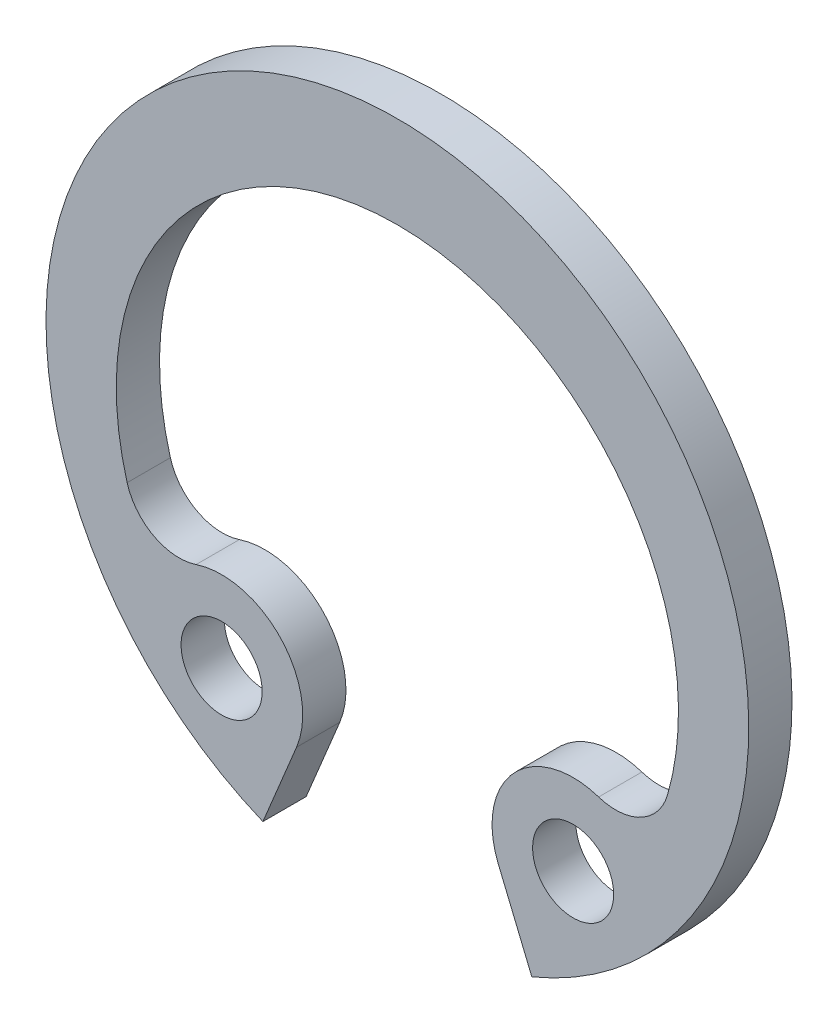
ISO-10303-21;
HEADER;
FILE_DESCRIPTION(('STEP AP214'),'2;1');
FILE_NAME('part.step','',(''),(''),'','','');
FILE_SCHEMA(('AUTOMOTIVE_DESIGN { 1 0 10303 214 1 1 1 1 }'));
ENDSEC;
DATA;
#1=APPLICATION_CONTEXT('core data for automotive mechanical design processes');
#2=APPLICATION_PROTOCOL_DEFINITION('international standard','automotive_design',2000,#1);
#3=PRODUCT_CONTEXT('',#1,'mechanical');
#4=PRODUCT('Part','Part','',(#3));
#5=PRODUCT_RELATED_PRODUCT_CATEGORY('part','',(#4));
#6=PRODUCT_DEFINITION_FORMATION('','',#4);
#7=PRODUCT_DEFINITION_CONTEXT('part definition',#1,'design');
#8=PRODUCT_DEFINITION('design','',#6,#7);
#9=PRODUCT_DEFINITION_SHAPE('','',#8);
#10=(LENGTH_UNIT() NAMED_UNIT(*) SI_UNIT(.MILLI.,.METRE.));
#11=(NAMED_UNIT(*) PLANE_ANGLE_UNIT() SI_UNIT($,.RADIAN.));
#12=(NAMED_UNIT(*) SI_UNIT($,.STERADIAN.) SOLID_ANGLE_UNIT());
#13=UNCERTAINTY_MEASURE_WITH_UNIT(LENGTH_MEASURE(1.E-05),#10,'distance_accuracy_value','');
#14=(GEOMETRIC_REPRESENTATION_CONTEXT(3) GLOBAL_UNCERTAINTY_ASSIGNED_CONTEXT((#13)) GLOBAL_UNIT_ASSIGNED_CONTEXT((#10,
#11,#12)) REPRESENTATION_CONTEXT('',''));
#15=CARTESIAN_POINT('',(0.,0.,0.));
#16=DIRECTION('',(0.,0.,1.));
#17=DIRECTION('',(1.,0.,0.));
#18=AXIS2_PLACEMENT_3D('',#15,#16,#17);
#19=CARTESIAN_POINT('',(0.,0.,-0.8));
#20=DIRECTION('',(0.,0.,1.));
#21=DIRECTION('',(1.,0.,0.));
#22=AXIS2_PLACEMENT_3D('',#19,#20,#21);
#23=CYLINDRICAL_SURFACE('',#22,6.5);
#24=CARTESIAN_POINT('',(0.,0.,0.));
#25=DIRECTION('',(0.,0.,1.));
#26=DIRECTION('',(1.,0.,0.));
#27=AXIS2_PLACEMENT_3D('',#24,#25,#26);
#28=CIRCLE('',#27,6.5);
#29=CARTESIAN_POINT('',(2.48744231037309,-6.00521696132335,0.));
#30=VERTEX_POINT('',#29);
#31=CARTESIAN_POINT('',(-2.48744231037309,-6.00521696132336,0.));
#32=VERTEX_POINT('',#31);
#33=EDGE_CURVE('E129',#30,#32,#28,.T.);
#34=ORIENTED_EDGE('',*,*,#33,.F.);
#35=DIRECTION('',(0.,0.,1.));
#36=VECTOR('',#35,1.);
#37=CARTESIAN_POINT('',(2.48744231037309,-6.00521696132335,-0.8));
#38=LINE('',#37,#36);
#39=CARTESIAN_POINT('',(2.48744231037309,-6.00521696132335,-0.8));
#40=VERTEX_POINT('',#39);
#41=EDGE_CURVE('E11',#40,#30,#38,.T.);
#42=ORIENTED_EDGE('',*,*,#41,.F.);
#43=CARTESIAN_POINT('',(0.,0.,-0.8));
#44=DIRECTION('',(0.,0.,1.));
#45=DIRECTION('',(1.,0.,0.));
#46=AXIS2_PLACEMENT_3D('',#43,#44,#45);
#47=CIRCLE('',#46,6.5);
#48=CARTESIAN_POINT('',(-2.48744231037309,-6.00521696132336,-0.8));
#49=VERTEX_POINT('',#48);
#50=EDGE_CURVE('E150',#40,#49,#47,.T.);
#51=ORIENTED_EDGE('',*,*,#50,.T.);
#52=DIRECTION('',(0.,0.,1.));
#53=VECTOR('',#52,1.);
#54=CARTESIAN_POINT('',(-2.48744231037309,-6.00521696132336,-0.8));
#55=LINE('',#54,#53);
#56=EDGE_CURVE('E35',#49,#32,#55,.T.);
#57=ORIENTED_EDGE('',*,*,#56,.T.);
#58=EDGE_LOOP('',(#34,#42,#51,#57));
#59=FACE_BOUND('',#58,.T.);
#60=ADVANCED_FACE('F32',(#59),#23,.T.);
#61=CARTESIAN_POINT('',(1.86536094081114,-4.50337968202728,-0.8));
#62=DIRECTION('',(-0.923879532511287,-0.38268343236509,0.));
#63=DIRECTION('',(0.38268343236509,-0.923879532511287,0.));
#64=AXIS2_PLACEMENT_3D('',#61,#62,#63);
#65=PLANE('',#64);
#66=DIRECTION('',(0.38268343236509,-0.923879532511287,0.));
#67=VECTOR('',#66,1.);
#68=CARTESIAN_POINT('',(1.86536094081114,-4.50337968202728,0.));
#69=LINE('',#68,#67);
#70=CARTESIAN_POINT('',(1.86536094081114,-4.50337968202728,0.));
#71=VERTEX_POINT('',#70);
#72=EDGE_CURVE('E148',#71,#30,#69,.T.);
#73=ORIENTED_EDGE('',*,*,#72,.F.);
#74=DIRECTION('',(0.,0.,1.));
#75=VECTOR('',#74,1.);
#76=CARTESIAN_POINT('',(1.86536094081114,-4.50337968202728,-0.8));
#77=LINE('',#76,#75);
#78=CARTESIAN_POINT('',(1.86536094081114,-4.50337968202728,-0.8));
#79=VERTEX_POINT('',#78);
#80=EDGE_CURVE('E41',#79,#71,#77,.T.);
#81=ORIENTED_EDGE('',*,*,#80,.F.);
#82=DIRECTION('',(0.38268343236509,-0.923879532511287,0.));
#83=VECTOR('',#82,1.);
#84=CARTESIAN_POINT('',(1.86536094081114,-4.50337968202728,-0.8));
#85=LINE('',#84,#83);
#86=EDGE_CURVE('E119',#79,#40,#85,.T.);
#87=ORIENTED_EDGE('',*,*,#86,.T.);
#88=ORIENTED_EDGE('',*,*,#41,.T.);
#89=EDGE_LOOP('',(#73,#81,#87,#88));
#90=FACE_BOUND('',#89,.T.);
#91=ADVANCED_FACE('F162',(#90),#65,.T.);
#92=CARTESIAN_POINT('',(3.25118023957807,-3.92935453347964,-0.8));
#93=DIRECTION('',(0.,0.,1.));
#94=DIRECTION('',(1.,0.,0.));
#95=AXIS2_PLACEMENT_3D('',#92,#93,#94);
#96=CYLINDRICAL_SURFACE('',#95,1.5);
#97=CARTESIAN_POINT('',(3.25118023957807,-3.92935453347964,0.));
#98=DIRECTION('',(0.,0.,1.));
#99=DIRECTION('',(-1.,0.,0.));
#100=AXIS2_PLACEMENT_3D('',#97,#98,#99);
#101=CIRCLE('',#100,1.5);
#102=CARTESIAN_POINT('',(3.72308859827909,-2.5055207998618,0.));
#103=VERTEX_POINT('',#102);
#104=EDGE_CURVE('E106',#103,#71,#101,.T.);
#105=ORIENTED_EDGE('',*,*,#104,.F.);
#106=DIRECTION('',(0.,0.,1.));
#107=VECTOR('',#106,1.);
#108=CARTESIAN_POINT('',(3.72308859827909,-2.5055207998618,-0.8));
#109=LINE('',#108,#107);
#110=CARTESIAN_POINT('',(3.72308859827909,-2.5055207998618,-0.8));
#111=VERTEX_POINT('',#110);
#112=EDGE_CURVE('E101',#111,#103,#109,.T.);
#113=ORIENTED_EDGE('',*,*,#112,.F.);
#114=CARTESIAN_POINT('',(3.25118023957807,-3.92935453347964,-0.8));
#115=DIRECTION('',(0.,0.,1.));
#116=DIRECTION('',(-1.,0.,0.));
#117=AXIS2_PLACEMENT_3D('',#114,#115,#116);
#118=CIRCLE('',#117,1.5);
#119=EDGE_CURVE('E104',#111,#79,#118,.T.);
#120=ORIENTED_EDGE('',*,*,#119,.T.);
#121=ORIENTED_EDGE('',*,*,#80,.T.);
#122=EDGE_LOOP('',(#105,#113,#120,#121));
#123=FACE_BOUND('',#122,.T.);
#124=ADVANCED_FACE('F103',(#123),#96,.T.);
#125=CARTESIAN_POINT('',(4.03769417074644,-1.55629831078325,-0.8));
#126=DIRECTION('',(0.,0.,1.));
#127=DIRECTION('',(1.,0.,0.));
#128=AXIS2_PLACEMENT_3D('',#125,#126,#127);
#129=CYLINDRICAL_SURFACE('',#128,1.);
#130=CARTESIAN_POINT('',(4.03769417074644,-1.55629831078325,0.));
#131=DIRECTION('',(0.,0.,-1.));
#132=DIRECTION('',(-1.,0.,0.));
#133=AXIS2_PLACEMENT_3D('',#130,#131,#132);
#134=CIRCLE('',#133,1.);
#135=CARTESIAN_POINT('',(4.99904992568607,-1.83160743239831,0.));
#136=VERTEX_POINT('',#135);
#137=EDGE_CURVE('E145',#136,#103,#134,.T.);
#138=ORIENTED_EDGE('',*,*,#137,.F.);
#139=DIRECTION('',(0.,0.,1.));
#140=VECTOR('',#139,1.);
#141=CARTESIAN_POINT('',(4.99904992568607,-1.83160743239831,-0.8));
#142=LINE('',#141,#140);
#143=CARTESIAN_POINT('',(4.99904992568607,-1.83160743239831,-0.8));
#144=VERTEX_POINT('',#143);
#145=EDGE_CURVE('E111',#144,#136,#142,.T.);
#146=ORIENTED_EDGE('',*,*,#145,.F.);
#147=CARTESIAN_POINT('',(4.03769417074644,-1.55629831078325,-0.8));
#148=DIRECTION('',(0.,0.,-1.));
#149=DIRECTION('',(-1.,0.,0.));
#150=AXIS2_PLACEMENT_3D('',#147,#148,#149);
#151=CIRCLE('',#150,1.);
#152=EDGE_CURVE('E117',#144,#111,#151,.T.);
#153=ORIENTED_EDGE('',*,*,#152,.T.);
#154=ORIENTED_EDGE('',*,*,#112,.T.);
#155=EDGE_LOOP('',(#138,#146,#153,#154));
#156=FACE_BOUND('',#155,.T.);
#157=ADVANCED_FACE('F121',(#156),#129,.F.);
#158=CARTESIAN_POINT('',(0.,-0.4,-0.8));
#159=DIRECTION('',(0.,0.,1.));
#160=DIRECTION('',(1.,0.,0.));
#161=AXIS2_PLACEMENT_3D('',#158,#159,#160);
#162=CYLINDRICAL_SURFACE('',#161,5.2);
#163=CARTESIAN_POINT('',(0.,-0.4,0.));
#164=DIRECTION('',(0.,0.,-1.));
#165=DIRECTION('',(1.,0.,0.));
#166=AXIS2_PLACEMENT_3D('',#163,#164,#165);
#167=CIRCLE('',#166,5.2);
#168=CARTESIAN_POINT('',(-4.99904992568607,-1.83160743239831,0.));
#169=VERTEX_POINT('',#168);
#170=EDGE_CURVE('E142',#169,#136,#167,.T.);
#171=ORIENTED_EDGE('',*,*,#170,.F.);
#172=DIRECTION('',(0.,0.,1.));
#173=VECTOR('',#172,1.);
#174=CARTESIAN_POINT('',(-4.99904992568607,-1.83160743239831,-0.8));
#175=LINE('',#174,#173);
#176=CARTESIAN_POINT('',(-4.99904992568607,-1.83160743239831,-0.8));
#177=VERTEX_POINT('',#176);
#178=EDGE_CURVE('E154',#177,#169,#175,.T.);
#179=ORIENTED_EDGE('',*,*,#178,.F.);
#180=CARTESIAN_POINT('',(0.,-0.4,-0.8));
#181=DIRECTION('',(0.,0.,-1.));
#182=DIRECTION('',(1.,0.,0.));
#183=AXIS2_PLACEMENT_3D('',#180,#181,#182);
#184=CIRCLE('',#183,5.2);
#185=EDGE_CURVE('E122',#177,#144,#184,.T.);
#186=ORIENTED_EDGE('',*,*,#185,.T.);
#187=ORIENTED_EDGE('',*,*,#145,.T.);
#188=EDGE_LOOP('',(#171,#179,#186,#187));
#189=FACE_BOUND('',#188,.T.);
#190=ADVANCED_FACE('F175',(#189),#162,.F.);
#191=CARTESIAN_POINT('',(-4.03769417074644,-1.55629831078325,-0.8));
#192=DIRECTION('',(0.,0.,1.));
#193=DIRECTION('',(1.,0.,0.));
#194=AXIS2_PLACEMENT_3D('',#191,#192,#193);
#195=CYLINDRICAL_SURFACE('',#194,1.);
#196=CARTESIAN_POINT('',(-4.03769417074644,-1.55629831078325,0.));
#197=DIRECTION('',(0.,0.,-1.));
#198=DIRECTION('',(1.,0.,0.));
#199=AXIS2_PLACEMENT_3D('',#196,#197,#198);
#200=CIRCLE('',#199,1.);
#201=CARTESIAN_POINT('',(-3.7230885982791,-2.50552079986181,0.));
#202=VERTEX_POINT('',#201);
#203=EDGE_CURVE('E139',#202,#169,#200,.T.);
#204=ORIENTED_EDGE('',*,*,#203,.F.);
#205=DIRECTION('',(0.,0.,1.));
#206=VECTOR('',#205,1.);
#207=CARTESIAN_POINT('',(-3.7230885982791,-2.50552079986181,-0.8));
#208=LINE('',#207,#206);
#209=CARTESIAN_POINT('',(-3.7230885982791,-2.50552079986181,-0.8));
#210=VERTEX_POINT('',#209);
#211=EDGE_CURVE('E156',#210,#202,#208,.T.);
#212=ORIENTED_EDGE('',*,*,#211,.F.);
#213=CARTESIAN_POINT('',(-4.03769417074644,-1.55629831078325,-0.8));
#214=DIRECTION('',(0.,0.,-1.));
#215=DIRECTION('',(1.,0.,0.));
#216=AXIS2_PLACEMENT_3D('',#213,#214,#215);
#217=CIRCLE('',#216,1.);
#218=EDGE_CURVE('E124',#210,#177,#217,.T.);
#219=ORIENTED_EDGE('',*,*,#218,.T.);
#220=ORIENTED_EDGE('',*,*,#178,.T.);
#221=EDGE_LOOP('',(#204,#212,#219,#220));
#222=FACE_BOUND('',#221,.T.);
#223=ADVANCED_FACE('F178',(#222),#195,.F.);
#224=CARTESIAN_POINT('',(-3.25118023957807,-3.92935453347965,-0.8));
#225=DIRECTION('',(0.,0.,1.));
#226=DIRECTION('',(1.,0.,0.));
#227=AXIS2_PLACEMENT_3D('',#224,#225,#226);
#228=CYLINDRICAL_SURFACE('',#227,1.5);
#229=CARTESIAN_POINT('',(-3.25118023957807,-3.92935453347965,0.));
#230=DIRECTION('',(0.,0.,1.));
#231=DIRECTION('',(1.,0.,0.));
#232=AXIS2_PLACEMENT_3D('',#229,#230,#231);
#233=CIRCLE('',#232,1.5);
#234=CARTESIAN_POINT('',(-1.86536094081114,-4.50337968202728,0.));
#235=VERTEX_POINT('',#234);
#236=EDGE_CURVE('E136',#235,#202,#233,.T.);
#237=ORIENTED_EDGE('',*,*,#236,.F.);
#238=DIRECTION('',(0.,0.,1.));
#239=VECTOR('',#238,1.);
#240=CARTESIAN_POINT('',(-1.86536094081114,-4.50337968202728,-0.8));
#241=LINE('',#240,#239);
#242=CARTESIAN_POINT('',(-1.86536094081114,-4.50337968202728,-0.8));
#243=VERTEX_POINT('',#242);
#244=EDGE_CURVE('E157',#243,#235,#241,.T.);
#245=ORIENTED_EDGE('',*,*,#244,.F.);
#246=CARTESIAN_POINT('',(-3.25118023957807,-3.92935453347965,-0.8));
#247=DIRECTION('',(0.,0.,1.));
#248=DIRECTION('',(1.,0.,0.));
#249=AXIS2_PLACEMENT_3D('',#246,#247,#248);
#250=CIRCLE('',#249,1.5);
#251=EDGE_CURVE('E224',#243,#210,#250,.T.);
#252=ORIENTED_EDGE('',*,*,#251,.T.);
#253=ORIENTED_EDGE('',*,*,#211,.T.);
#254=EDGE_LOOP('',(#237,#245,#252,#253));
#255=FACE_BOUND('',#254,.T.);
#256=ADVANCED_FACE('F182',(#255),#228,.T.);
#257=CARTESIAN_POINT('',(-1.86536094081114,-4.50337968202728,-0.8));
#258=DIRECTION('',(0.923879532511287,-0.38268343236509,0.));
#259=DIRECTION('',(0.38268343236509,0.923879532511287,0.));
#260=AXIS2_PLACEMENT_3D('',#257,#258,#259);
#261=PLANE('',#260);
#262=DIRECTION('',(0.38268343236509,0.923879532511287,0.));
#263=VECTOR('',#262,1.);
#264=CARTESIAN_POINT('',(-1.86536094081114,-4.50337968202728,0.));
#265=LINE('',#264,#263);
#266=EDGE_CURVE('E132',#32,#235,#265,.T.);
#267=ORIENTED_EDGE('',*,*,#266,.F.);
#268=ORIENTED_EDGE('',*,*,#56,.F.);
#269=DIRECTION('',(0.38268343236509,0.923879532511287,0.));
#270=VECTOR('',#269,1.);
#271=CARTESIAN_POINT('',(-1.86536094081114,-4.50337968202728,-0.8));
#272=LINE('',#271,#270);
#273=EDGE_CURVE('E222',#49,#243,#272,.T.);
#274=ORIENTED_EDGE('',*,*,#273,.T.);
#275=ORIENTED_EDGE('',*,*,#244,.T.);
#276=EDGE_LOOP('',(#267,#268,#274,#275));
#277=FACE_BOUND('',#276,.T.);
#278=ADVANCED_FACE('F159',(#277),#261,.T.);
#279=CARTESIAN_POINT('',(0.,0.,-0.8));
#280=DIRECTION('',(0.,0.,1.));
#281=DIRECTION('',(1.,0.,0.));
#282=AXIS2_PLACEMENT_3D('',#279,#280,#281);
#283=PLANE('',#282);
#284=CARTESIAN_POINT('',(-3.25118023957807,-3.92935453347965,-0.8));
#285=DIRECTION('',(0.,0.,1.));
#286=DIRECTION('',(1.,0.,0.));
#287=AXIS2_PLACEMENT_3D('',#284,#285,#286);
#288=CIRCLE('',#287,0.75);
#289=CARTESIAN_POINT('',(-2.50118023957807,-3.92935453347965,-0.8));
#290=VERTEX_POINT('',#289);
#291=EDGE_CURVE('E209',#290,#290,#288,.T.);
#292=ORIENTED_EDGE('',*,*,#291,.T.);
#293=EDGE_LOOP('',(#292));
#294=FACE_BOUND('',#293,.T.);
#295=CARTESIAN_POINT('',(3.25118023957807,-3.92935453347964,-0.8));
#296=DIRECTION('',(0.,0.,1.));
#297=DIRECTION('',(-1.,0.,0.));
#298=AXIS2_PLACEMENT_3D('',#295,#296,#297);
#299=CIRCLE('',#298,0.75);
#300=CARTESIAN_POINT('',(2.50118023957807,-3.92935453347964,-0.8));
#301=VERTEX_POINT('',#300);
#302=EDGE_CURVE('E133',#301,#301,#299,.T.);
#303=ORIENTED_EDGE('',*,*,#302,.T.);
#304=EDGE_LOOP('',(#303));
#305=FACE_BOUND('',#304,.T.);
#306=ORIENTED_EDGE('',*,*,#50,.F.);
#307=ORIENTED_EDGE('',*,*,#86,.F.);
#308=ORIENTED_EDGE('',*,*,#119,.F.);
#309=ORIENTED_EDGE('',*,*,#152,.F.);
#310=ORIENTED_EDGE('',*,*,#185,.F.);
#311=ORIENTED_EDGE('',*,*,#218,.F.);
#312=ORIENTED_EDGE('',*,*,#251,.F.);
#313=ORIENTED_EDGE('',*,*,#273,.F.);
#314=EDGE_LOOP('',(#306,#307,#308,#309,#310,#311,#312,#313));
#315=FACE_BOUND('',#314,.T.);
#316=ADVANCED_FACE('F115',(#294,#305,#315),#283,.F.);
#317=CARTESIAN_POINT('',(0.,0.,0.));
#318=DIRECTION('',(0.,0.,1.));
#319=DIRECTION('',(1.,0.,0.));
#320=AXIS2_PLACEMENT_3D('',#317,#318,#319);
#321=PLANE('',#320);
#322=CARTESIAN_POINT('',(-3.25118023957807,-3.92935453347965,0.));
#323=DIRECTION('',(0.,0.,1.));
#324=DIRECTION('',(1.,0.,0.));
#325=AXIS2_PLACEMENT_3D('',#322,#323,#324);
#326=CIRCLE('',#325,0.75);
#327=CARTESIAN_POINT('',(-2.50118023957807,-3.92935453347965,0.));
#328=VERTEX_POINT('',#327);
#329=EDGE_CURVE('E212',#328,#328,#326,.T.);
#330=ORIENTED_EDGE('',*,*,#329,.F.);
#331=EDGE_LOOP('',(#330));
#332=FACE_BOUND('',#331,.T.);
#333=CARTESIAN_POINT('',(3.25118023957807,-3.92935453347964,0.));
#334=DIRECTION('',(0.,0.,1.));
#335=DIRECTION('',(-1.,0.,0.));
#336=AXIS2_PLACEMENT_3D('',#333,#334,#335);
#337=CIRCLE('',#336,0.75);
#338=CARTESIAN_POINT('',(2.50118023957807,-3.92935453347964,0.));
#339=VERTEX_POINT('',#338);
#340=EDGE_CURVE('E214',#339,#339,#337,.T.);
#341=ORIENTED_EDGE('',*,*,#340,.F.);
#342=EDGE_LOOP('',(#341));
#343=FACE_BOUND('',#342,.T.);
#344=ORIENTED_EDGE('',*,*,#33,.T.);
#345=ORIENTED_EDGE('',*,*,#266,.T.);
#346=ORIENTED_EDGE('',*,*,#236,.T.);
#347=ORIENTED_EDGE('',*,*,#203,.T.);
#348=ORIENTED_EDGE('',*,*,#170,.T.);
#349=ORIENTED_EDGE('',*,*,#137,.T.);
#350=ORIENTED_EDGE('',*,*,#104,.T.);
#351=ORIENTED_EDGE('',*,*,#72,.T.);
#352=EDGE_LOOP('',(#344,#345,#346,#347,#348,#349,#350,#351));
#353=FACE_BOUND('',#352,.T.);
#354=ADVANCED_FACE('F161',(#332,#343,#353),#321,.T.);
#355=CARTESIAN_POINT('',(3.25118023957807,-3.92935453347964,-0.8));
#356=DIRECTION('',(0.,0.,1.));
#357=DIRECTION('',(1.,0.,0.));
#358=AXIS2_PLACEMENT_3D('',#355,#356,#357);
#359=CYLINDRICAL_SURFACE('',#358,0.75);
#360=ORIENTED_EDGE('',*,*,#302,.F.);
#361=EDGE_LOOP('',(#360));
#362=FACE_BOUND('',#361,.T.);
#363=ORIENTED_EDGE('',*,*,#340,.T.);
#364=EDGE_LOOP('',(#363));
#365=FACE_BOUND('',#364,.T.);
#366=ADVANCED_FACE('F194',(#362,#365),#359,.F.);
#367=CARTESIAN_POINT('',(-3.25118023957807,-3.92935453347965,-0.8));
#368=DIRECTION('',(0.,0.,1.));
#369=DIRECTION('',(1.,0.,0.));
#370=AXIS2_PLACEMENT_3D('',#367,#368,#369);
#371=CYLINDRICAL_SURFACE('',#370,0.75);
#372=ORIENTED_EDGE('',*,*,#291,.F.);
#373=EDGE_LOOP('',(#372));
#374=FACE_BOUND('',#373,.T.);
#375=ORIENTED_EDGE('',*,*,#329,.T.);
#376=EDGE_LOOP('',(#375));
#377=FACE_BOUND('',#376,.T.);
#378=ADVANCED_FACE('F201',(#374,#377),#371,.F.);
#379=CLOSED_SHELL('',(#60,#91,#124,#157,#190,#223,#256,#278,#316,#354,#366,#378));
#380=MANIFOLD_SOLID_BREP('B2',#379);
#381=ADVANCED_BREP_SHAPE_REPRESENTATION('',(#18,#380),#14);
#382=SHAPE_DEFINITION_REPRESENTATION(#9,#381);
ENDSEC;
END-ISO-10303-21;
